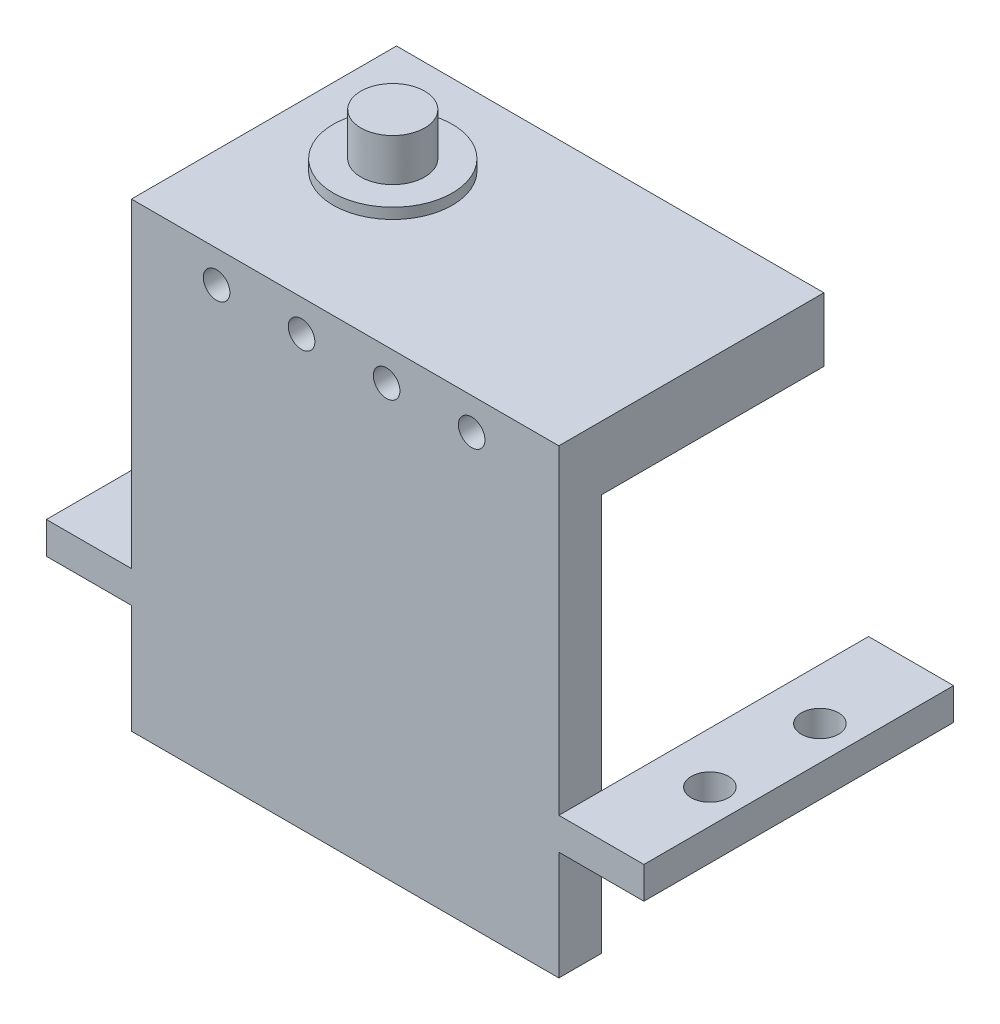
ISO-10303-21;
HEADER;
FILE_DESCRIPTION(('STEP AP214'),'2;1');
FILE_NAME('part.step','',(''),(''),'','','');
FILE_SCHEMA(('AUTOMOTIVE_DESIGN { 1 0 10303 214 1 1 1 1 }'));
ENDSEC;
DATA;
#1=APPLICATION_CONTEXT('core data for automotive mechanical design processes');
#2=APPLICATION_PROTOCOL_DEFINITION('international standard','automotive_design',2000,#1);
#3=PRODUCT_CONTEXT('',#1,'mechanical');
#4=PRODUCT('Part','Part','',(#3));
#5=PRODUCT_RELATED_PRODUCT_CATEGORY('part','',(#4));
#6=PRODUCT_DEFINITION_FORMATION('','',#4);
#7=PRODUCT_DEFINITION_CONTEXT('part definition',#1,'design');
#8=PRODUCT_DEFINITION('design','',#6,#7);
#9=PRODUCT_DEFINITION_SHAPE('','',#8);
#10=(LENGTH_UNIT() NAMED_UNIT(*) SI_UNIT(.MILLI.,.METRE.));
#11=(NAMED_UNIT(*) PLANE_ANGLE_UNIT() SI_UNIT($,.RADIAN.));
#12=(NAMED_UNIT(*) SI_UNIT($,.STERADIAN.) SOLID_ANGLE_UNIT());
#13=UNCERTAINTY_MEASURE_WITH_UNIT(LENGTH_MEASURE(1.E-05),#10,'distance_accuracy_value','');
#14=(GEOMETRIC_REPRESENTATION_CONTEXT(3) GLOBAL_UNCERTAINTY_ASSIGNED_CONTEXT((#13)) GLOBAL_UNIT_ASSIGNED_CONTEXT((#10,
#11,#12)) REPRESENTATION_CONTEXT('',''));
#15=CARTESIAN_POINT('',(0.,0.,0.));
#16=DIRECTION('',(0.,0.,1.));
#17=DIRECTION('',(1.,0.,0.));
#18=AXIS2_PLACEMENT_3D('',#15,#16,#17);
#19=CARTESIAN_POINT('',(-128.644230062294,-7.05911649459757,-10.5799999999999));
#20=DIRECTION('',(0.,-1.,0.));
#21=DIRECTION('',(0.,0.,-1.));
#22=AXIS2_PLACEMENT_3D('',#19,#20,#21);
#23=CYLINDRICAL_SURFACE('',#22,5.59999999999998);
#24=CARTESIAN_POINT('',(-128.644230062294,-7.05911649459757,-10.5799999999999));
#25=DIRECTION('',(0.,1.,0.));
#26=DIRECTION('',(0.,0.,1.));
#27=AXIS2_PLACEMENT_3D('',#24,#25,#26);
#28=CIRCLE('',#27,5.59999999999998);
#29=CARTESIAN_POINT('',(-128.644230062294,-7.05911649459757,-4.97999999999991));
#30=VERTEX_POINT('',#29);
#31=EDGE_CURVE('E51',#30,#30,#28,.T.);
#32=ORIENTED_EDGE('',*,*,#31,.F.);
#33=EDGE_LOOP('',(#32));
#34=FACE_BOUND('',#33,.T.);
#35=CARTESIAN_POINT('',(-128.644230062294,-8.05911649459757,-10.5799999999999));
#36=DIRECTION('',(0.,1.,0.));
#37=DIRECTION('',(0.,0.,1.));
#38=AXIS2_PLACEMENT_3D('',#35,#36,#37);
#39=CIRCLE('',#38,5.59999999999998);
#40=CARTESIAN_POINT('',(-128.644230062294,-8.05911649459757,-4.97999999999991));
#41=VERTEX_POINT('',#40);
#42=EDGE_CURVE('E56',#41,#41,#39,.T.);
#43=ORIENTED_EDGE('',*,*,#42,.T.);
#44=EDGE_LOOP('',(#43));
#45=FACE_BOUND('',#44,.T.);
#46=ADVANCED_FACE('F44',(#34,#45),#23,.T.);
#47=CARTESIAN_POINT('',(0.,-7.05911649459757,0.));
#48=DIRECTION('',(0.,1.,0.));
#49=DIRECTION('',(0.,0.,1.));
#50=AXIS2_PLACEMENT_3D('',#47,#48,#49);
#51=PLANE('',#50);
#52=CARTESIAN_POINT('',(-128.644230062294,-7.05911649459757,-10.5799999999999));
#53=DIRECTION('',(0.,1.,0.));
#54=DIRECTION('',(0.,0.,1.));
#55=AXIS2_PLACEMENT_3D('',#52,#53,#54);
#56=CIRCLE('',#55,2.99999999999999);
#57=CARTESIAN_POINT('',(-128.644230062294,-7.05911649459757,-7.5799999999999));
#58=VERTEX_POINT('',#57);
#59=EDGE_CURVE('E11',#58,#58,#56,.T.);
#60=ORIENTED_EDGE('',*,*,#59,.F.);
#61=EDGE_LOOP('',(#60));
#62=FACE_BOUND('',#61,.T.);
#63=ORIENTED_EDGE('',*,*,#31,.T.);
#64=EDGE_LOOP('',(#63));
#65=FACE_BOUND('',#64,.T.);
#66=ADVANCED_FACE('F89',(#62,#65),#51,.T.);
#67=CARTESIAN_POINT('',(0.,-8.05911649459757,0.));
#68=DIRECTION('',(0.,1.,0.));
#69=DIRECTION('',(0.,0.,1.));
#70=AXIS2_PLACEMENT_3D('',#67,#68,#69);
#71=PLANE('',#70);
#72=CARTESIAN_POINT('',(-128.644230062294,-8.05911649459757,-10.5799999999999));
#73=DIRECTION('',(0.,1.,0.));
#74=DIRECTION('',(0.,0.,1.));
#75=AXIS2_PLACEMENT_3D('',#72,#73,#74);
#76=CIRCLE('',#75,2.99999999999999);
#77=CARTESIAN_POINT('',(-128.644230062294,-8.05911649459757,-7.5799999999999));
#78=VERTEX_POINT('',#77);
#79=EDGE_CURVE('E47',#78,#78,#76,.T.);
#80=ORIENTED_EDGE('',*,*,#79,.T.);
#81=EDGE_LOOP('',(#80));
#82=FACE_BOUND('',#81,.T.);
#83=ORIENTED_EDGE('',*,*,#42,.F.);
#84=EDGE_LOOP('',(#83));
#85=FACE_BOUND('',#84,.T.);
#86=ADVANCED_FACE('F94',(#82,#85),#71,.F.);
#87=CARTESIAN_POINT('',(-128.644230062294,-9.05911649459755,-10.5799999999999));
#88=DIRECTION('',(0.,1.,0.));
#89=DIRECTION('',(-1.,0.,0.));
#90=AXIS2_PLACEMENT_3D('',#87,#88,#89);
#91=PLANE('',#90);
#92=CARTESIAN_POINT('',(-128.644230062294,-9.05911649459755,-10.5799999999999));
#93=DIRECTION('',(0.,1.,0.));
#94=DIRECTION('',(-1.,0.,0.));
#95=AXIS2_PLACEMENT_3D('',#92,#93,#94);
#96=CIRCLE('',#95,2.99999999999999);
#97=CARTESIAN_POINT('',(-131.644230062294,-9.05911649459755,-10.5799999999999));
#98=VERTEX_POINT('',#97);
#99=EDGE_CURVE('E59',#98,#98,#96,.T.);
#100=ORIENTED_EDGE('',*,*,#99,.F.);
#101=EDGE_LOOP('',(#100));
#102=FACE_BOUND('',#101,.T.);
#103=ADVANCED_FACE('F85',(#102),#91,.F.);
#104=CARTESIAN_POINT('',(-128.644230062294,-9.05911649459755,-10.5799999999999));
#105=DIRECTION('',(0.,1.,0.));
#106=DIRECTION('',(-1.,0.,0.));
#107=AXIS2_PLACEMENT_3D('',#104,#105,#106);
#108=CYLINDRICAL_SURFACE('',#107,2.99999999999999);
#109=ORIENTED_EDGE('',*,*,#99,.T.);
#110=EDGE_LOOP('',(#109));
#111=FACE_BOUND('',#110,.T.);
#112=ORIENTED_EDGE('',*,*,#79,.F.);
#113=EDGE_LOOP('',(#112));
#114=FACE_BOUND('',#113,.T.);
#115=ADVANCED_FACE('F78',(#111,#114),#108,.T.);
#116=ORIENTED_EDGE('',*,*,#59,.T.);
#117=EDGE_LOOP('',(#116));
#118=FACE_BOUND('',#117,.T.);
#119=CARTESIAN_POINT('',(-128.644230062294,-3.05911649459755,-10.5799999999999));
#120=DIRECTION('',(0.,1.,0.));
#121=DIRECTION('',(-1.,0.,0.));
#122=AXIS2_PLACEMENT_3D('',#119,#120,#121);
#123=CIRCLE('',#122,2.99999999999999);
#124=CARTESIAN_POINT('',(-131.644230062294,-3.05911649459755,-10.5799999999999));
#125=VERTEX_POINT('',#124);
#126=EDGE_CURVE('E68',#125,#125,#123,.T.);
#127=ORIENTED_EDGE('',*,*,#126,.F.);
#128=EDGE_LOOP('',(#127));
#129=FACE_BOUND('',#128,.T.);
#130=ADVANCED_FACE('F76',(#118,#129),#108,.T.);
#131=CARTESIAN_POINT('',(-128.644230062294,-3.05911649459755,-10.5799999999999));
#132=DIRECTION('',(0.,1.,0.));
#133=DIRECTION('',(-1.,0.,0.));
#134=AXIS2_PLACEMENT_3D('',#131,#132,#133);
#135=PLANE('',#134);
#136=ORIENTED_EDGE('',*,*,#126,.T.);
#137=EDGE_LOOP('',(#136));
#138=FACE_BOUND('',#137,.T.);
#139=ADVANCED_FACE('F74',(#138),#135,.T.);
#140=CLOSED_SHELL('',(#46,#66,#86,#103,#115,#130,#139));
#141=MANIFOLD_SOLID_BREP('B2',#140);
#142=CARTESIAN_POINT('',(0.,0.,-20.93));
#143=DIRECTION('',(0.,0.,1.));
#144=DIRECTION('',(1.,0.,0.));
#145=AXIS2_PLACEMENT_3D('',#142,#143,#144);
#146=PLANE('',#145);
#147=CARTESIAN_POINT('',(-106.644230049022,-11.0591164996487,-20.93));
#148=DIRECTION('',(0.,0.,1.));
#149=DIRECTION('',(1.,0.,0.));
#150=AXIS2_PLACEMENT_3D('',#147,#148,#149);
#151=CIRCLE('',#150,1.25);
#152=CARTESIAN_POINT('',(-105.394230049022,-11.0591164996487,-20.93));
#153=VERTEX_POINT('',#152);
#154=EDGE_CURVE('E813',#153,#153,#151,.F.);
#155=ORIENTED_EDGE('',*,*,#154,.F.);
#156=EDGE_LOOP('',(#155));
#157=FACE_BOUND('',#156,.T.);
#158=CARTESIAN_POINT('',(-122.644230049022,-11.0591164996487,-20.93));
#159=DIRECTION('',(0.,0.,1.));
#160=DIRECTION('',(1.,0.,0.));
#161=AXIS2_PLACEMENT_3D('',#158,#159,#160);
#162=CIRCLE('',#161,1.25);
#163=CARTESIAN_POINT('',(-121.394230049022,-11.0591164996487,-20.93));
#164=VERTEX_POINT('',#163);
#165=EDGE_CURVE('E811',#164,#164,#162,.F.);
#166=ORIENTED_EDGE('',*,*,#165,.F.);
#167=EDGE_LOOP('',(#166));
#168=FACE_BOUND('',#167,.T.);
#169=CARTESIAN_POINT('',(-114.644230049022,-11.0591164996487,-20.93));
#170=DIRECTION('',(0.,0.,1.));
#171=DIRECTION('',(1.,0.,0.));
#172=AXIS2_PLACEMENT_3D('',#169,#170,#171);
#173=CIRCLE('',#172,1.25);
#174=CARTESIAN_POINT('',(-113.394230049022,-11.0591164996487,-20.93));
#175=VERTEX_POINT('',#174);
#176=EDGE_CURVE('E418',#175,#175,#173,.F.);
#177=ORIENTED_EDGE('',*,*,#176,.F.);
#178=EDGE_LOOP('',(#177));
#179=FACE_BOUND('',#178,.T.);
#180=DIRECTION('',(0.,1.,0.));
#181=VECTOR('',#180,1.);
#182=CARTESIAN_POINT('',(-138.644230049022,-8.05911649459757,-20.93));
#183=LINE('',#182,#181);
#184=CARTESIAN_POINT('',(-138.644230049022,-14.0591164945976,-20.93));
#185=VERTEX_POINT('',#184);
#186=CARTESIAN_POINT('',(-138.644230049022,-8.05911649459757,-20.93));
#187=VERTEX_POINT('',#186);
#188=EDGE_CURVE('E396',#185,#187,#183,.T.);
#189=ORIENTED_EDGE('',*,*,#188,.T.);
#190=DIRECTION('',(1.,0.,0.));
#191=VECTOR('',#190,1.);
#192=CARTESIAN_POINT('',(-98.4442300490215,-8.05911649459757,-20.93));
#193=LINE('',#192,#191);
#194=CARTESIAN_POINT('',(-98.4442300490215,-8.05911649459757,-20.93));
#195=VERTEX_POINT('',#194);
#196=EDGE_CURVE('E404',#187,#195,#193,.T.);
#197=ORIENTED_EDGE('',*,*,#196,.T.);
#198=DIRECTION('',(0.,-1.,0.));
#199=VECTOR('',#198,1.);
#200=CARTESIAN_POINT('',(-98.4442300490215,-14.0591164945976,-20.93));
#201=LINE('',#200,#199);
#202=CARTESIAN_POINT('',(-98.4442300490215,-14.0591164945976,-20.93));
#203=VERTEX_POINT('',#202);
#204=EDGE_CURVE('E410',#195,#203,#201,.T.);
#205=ORIENTED_EDGE('',*,*,#204,.T.);
#206=DIRECTION('',(-1.,0.,0.));
#207=VECTOR('',#206,1.);
#208=CARTESIAN_POINT('',(-138.644230049022,-14.0591164945976,-20.93));
#209=LINE('',#208,#207);
#210=EDGE_CURVE('E414',#203,#185,#209,.T.);
#211=ORIENTED_EDGE('',*,*,#210,.T.);
#212=EDGE_LOOP('',(#189,#197,#205,#211));
#213=FACE_BOUND('',#212,.T.);
#214=CARTESIAN_POINT('',(-130.63625074283,-11.0591164945976,-20.93));
#215=DIRECTION('',(0.,0.,1.));
#216=DIRECTION('',(1.,0.,0.));
#217=AXIS2_PLACEMENT_3D('',#214,#215,#216);
#218=CIRCLE('',#217,1.25000000000001);
#219=CARTESIAN_POINT('',(-129.38625074283,-11.0591164945976,-20.93));
#220=VERTEX_POINT('',#219);
#221=EDGE_CURVE('E153',#220,#220,#218,.F.);
#222=ORIENTED_EDGE('',*,*,#221,.F.);
#223=EDGE_LOOP('',(#222));
#224=FACE_BOUND('',#223,.T.);
#225=ADVANCED_FACE('F149',(#157,#168,#179,#213,#224),#146,.F.);
#226=CARTESIAN_POINT('',(0.,0.,0.));
#227=DIRECTION('',(0.,0.,1.));
#228=DIRECTION('',(1.,0.,0.));
#229=AXIS2_PLACEMENT_3D('',#226,#227,#228);
#230=PLANE('',#229);
#231=DIRECTION('',(-1.,0.,0.));
#232=VECTOR('',#231,1.);
#233=CARTESIAN_POINT('',(-138.644230049022,-14.0591164945976,0.));
#234=LINE('',#233,#232);
#235=CARTESIAN_POINT('',(-98.4442300490215,-14.0591164945976,0.));
#236=VERTEX_POINT('',#235);
#237=CARTESIAN_POINT('',(-138.644230049022,-14.0591164945976,0.));
#238=VERTEX_POINT('',#237);
#239=EDGE_CURVE('E416',#236,#238,#234,.T.);
#240=ORIENTED_EDGE('',*,*,#239,.F.);
#241=DIRECTION('',(0.,1.,0.));
#242=VECTOR('',#241,1.);
#243=CARTESIAN_POINT('',(-98.4442300490215,0.,0.));
#244=LINE('',#243,#242);
#245=CARTESIAN_POINT('',(-98.4442300490215,-38.1591164945976,0.));
#246=VERTEX_POINT('',#245);
#247=EDGE_CURVE('E262',#246,#236,#244,.T.);
#248=ORIENTED_EDGE('',*,*,#247,.F.);
#249=DIRECTION('',(0.,1.,0.));
#250=VECTOR('',#249,1.);
#251=CARTESIAN_POINT('',(-98.4442300490215,-41.1591164945976,0.));
#252=LINE('',#251,#250);
#253=CARTESIAN_POINT('',(-98.4442300490216,-41.1591164945976,0.));
#254=VERTEX_POINT('',#253);
#255=EDGE_CURVE('E308',#254,#246,#252,.T.);
#256=ORIENTED_EDGE('',*,*,#255,.F.);
#257=DIRECTION('',(0.,-1.,0.));
#258=VECTOR('',#257,1.);
#259=CARTESIAN_POINT('',(-98.4442300490216,0.,0.));
#260=LINE('',#259,#258);
#261=CARTESIAN_POINT('',(-98.4442300490216,-51.4091164945976,0.));
#262=VERTEX_POINT('',#261);
#263=EDGE_CURVE('E258',#254,#262,#260,.T.);
#264=ORIENTED_EDGE('',*,*,#263,.T.);
#265=DIRECTION('',(-1.,0.,0.));
#266=VECTOR('',#265,1.);
#267=CARTESIAN_POINT('',(0.,-51.4091164945976,0.));
#268=LINE('',#267,#266);
#269=CARTESIAN_POINT('',(-138.644230049022,-51.4091164945976,0.));
#270=VERTEX_POINT('',#269);
#271=EDGE_CURVE('E256',#262,#270,#268,.T.);
#272=ORIENTED_EDGE('',*,*,#271,.T.);
#273=DIRECTION('',(0.,1.,0.));
#274=VECTOR('',#273,1.);
#275=CARTESIAN_POINT('',(-138.644230049022,0.,0.));
#276=LINE('',#275,#274);
#277=CARTESIAN_POINT('',(-138.644230049022,-41.1591164945976,0.));
#278=VERTEX_POINT('',#277);
#279=EDGE_CURVE('E268',#270,#278,#276,.T.);
#280=ORIENTED_EDGE('',*,*,#279,.T.);
#281=DIRECTION('',(0.,1.,0.));
#282=VECTOR('',#281,1.);
#283=CARTESIAN_POINT('',(-138.644230049022,0.,0.));
#284=LINE('',#283,#282);
#285=CARTESIAN_POINT('',(-138.644230049022,-38.1591164945976,0.));
#286=VERTEX_POINT('',#285);
#287=EDGE_CURVE('E312',#278,#286,#284,.T.);
#288=ORIENTED_EDGE('',*,*,#287,.T.);
#289=DIRECTION('',(0.,1.,0.));
#290=VECTOR('',#289,1.);
#291=CARTESIAN_POINT('',(-138.644230049022,0.,0.));
#292=LINE('',#291,#290);
#293=EDGE_CURVE('E265',#286,#238,#292,.T.);
#294=ORIENTED_EDGE('',*,*,#293,.T.);
#295=EDGE_LOOP('',(#240,#248,#256,#264,#272,#280,#288,#294));
#296=FACE_BOUND('',#295,.T.);
#297=ADVANCED_FACE('F471',(#296),#230,.F.);
#298=CARTESIAN_POINT('',(0.,-51.4091164945976,4.));
#299=DIRECTION('',(0.,-1.,0.));
#300=DIRECTION('',(0.,0.,-1.));
#301=AXIS2_PLACEMENT_3D('',#298,#299,#300);
#302=PLANE('',#301);
#303=ORIENTED_EDGE('',*,*,#271,.F.);
#304=DIRECTION('',(0.,0.,-1.));
#305=VECTOR('',#304,1.);
#306=CARTESIAN_POINT('',(-98.4442300490216,-51.4091164945976,4.));
#307=LINE('',#306,#305);
#308=CARTESIAN_POINT('',(-98.4442300490216,-51.4091164945976,4.));
#309=VERTEX_POINT('',#308);
#310=EDGE_CURVE('E42',#309,#262,#307,.T.);
#311=ORIENTED_EDGE('',*,*,#310,.F.);
#312=DIRECTION('',(-1.,0.,0.));
#313=VECTOR('',#312,1.);
#314=CARTESIAN_POINT('',(0.,-51.4091164945976,4.));
#315=LINE('',#314,#313);
#316=CARTESIAN_POINT('',(-138.644230049022,-51.4091164945976,4.));
#317=VERTEX_POINT('',#316);
#318=EDGE_CURVE('E271',#309,#317,#315,.T.);
#319=ORIENTED_EDGE('',*,*,#318,.T.);
#320=DIRECTION('',(0.,0.,-1.));
#321=VECTOR('',#320,1.);
#322=CARTESIAN_POINT('',(-138.644230049022,-51.4091164945976,4.));
#323=LINE('',#322,#321);
#324=EDGE_CURVE('E167',#317,#270,#323,.T.);
#325=ORIENTED_EDGE('',*,*,#324,.T.);
#326=EDGE_LOOP('',(#303,#311,#319,#325));
#327=FACE_BOUND('',#326,.T.);
#328=ADVANCED_FACE('F151',(#327),#302,.T.);
#329=CARTESIAN_POINT('',(-98.4442300490216,0.,4.));
#330=DIRECTION('',(1.,0.,0.));
#331=DIRECTION('',(0.,0.,-1.));
#332=AXIS2_PLACEMENT_3D('',#329,#330,#331);
#333=PLANE('',#332);
#334=ORIENTED_EDGE('',*,*,#263,.F.);
#335=DIRECTION('',(0.,0.,-1.));
#336=VECTOR('',#335,1.);
#337=CARTESIAN_POINT('',(-98.4442300490216,-41.1591164945976,4.));
#338=LINE('',#337,#336);
#339=CARTESIAN_POINT('',(-98.4442300490216,-41.1591164945976,4.));
#340=VERTEX_POINT('',#339);
#341=EDGE_CURVE('E159',#340,#254,#338,.T.);
#342=ORIENTED_EDGE('',*,*,#341,.F.);
#343=DIRECTION('',(0.,-1.,0.));
#344=VECTOR('',#343,1.);
#345=CARTESIAN_POINT('',(-98.4442300490216,0.,4.));
#346=LINE('',#345,#344);
#347=EDGE_CURVE('E331',#340,#309,#346,.T.);
#348=ORIENTED_EDGE('',*,*,#347,.T.);
#349=ORIENTED_EDGE('',*,*,#310,.T.);
#350=EDGE_LOOP('',(#334,#342,#348,#349));
#351=FACE_BOUND('',#350,.T.);
#352=ADVANCED_FACE('F302',(#351),#333,.T.);
#353=CARTESIAN_POINT('',(0.,-41.1591164945976,4.));
#354=DIRECTION('',(0.,-1.,0.));
#355=DIRECTION('',(0.,0.,-1.));
#356=AXIS2_PLACEMENT_3D('',#353,#354,#355);
#357=PLANE('',#356);
#358=CARTESIAN_POINT('',(-93.6442300622939,-41.1591164945976,-15.7549999999999));
#359=DIRECTION('',(0.,-1.,0.));
#360=DIRECTION('',(0.,0.,-1.));
#361=AXIS2_PLACEMENT_3D('',#358,#359,#360);
#362=CIRCLE('',#361,1.75);
#363=CARTESIAN_POINT('',(-93.6442300622939,-41.1591164945976,-17.5049999999999));
#364=VERTEX_POINT('',#363);
#365=EDGE_CURVE('E445',#364,#364,#362,.T.);
#366=ORIENTED_EDGE('',*,*,#365,.F.);
#367=EDGE_LOOP('',(#366));
#368=FACE_BOUND('',#367,.T.);
#369=CARTESIAN_POINT('',(-93.6442300622939,-41.1591164945976,-5.40499999999994));
#370=DIRECTION('',(0.,-1.,0.));
#371=DIRECTION('',(0.,0.,-1.));
#372=AXIS2_PLACEMENT_3D('',#369,#370,#371);
#373=CIRCLE('',#372,1.75);
#374=CARTESIAN_POINT('',(-93.6442300622939,-41.1591164945976,-7.15499999999994));
#375=VERTEX_POINT('',#374);
#376=EDGE_CURVE('E451',#375,#375,#373,.T.);
#377=ORIENTED_EDGE('',*,*,#376,.F.);
#378=EDGE_LOOP('',(#377));
#379=FACE_BOUND('',#378,.T.);
#380=ORIENTED_EDGE('',*,*,#341,.T.);
#381=DIRECTION('',(0.,0.,1.));
#382=VECTOR('',#381,1.);
#383=CARTESIAN_POINT('',(-98.4442300490215,-41.1591164945976,-25.13));
#384=LINE('',#383,#382);
#385=CARTESIAN_POINT('',(-98.4442300490215,-41.1591164945976,-25.13));
#386=VERTEX_POINT('',#385);
#387=EDGE_CURVE('E295',#386,#254,#384,.T.);
#388=ORIENTED_EDGE('',*,*,#387,.F.);
#389=DIRECTION('',(-1.,0.,0.));
#390=VECTOR('',#389,1.);
#391=CARTESIAN_POINT('',(-90.4442300490216,-41.1591164945976,-25.13));
#392=LINE('',#391,#390);
#393=CARTESIAN_POINT('',(-90.4442300490216,-41.1591164945976,-25.13));
#394=VERTEX_POINT('',#393);
#395=EDGE_CURVE('E457',#394,#386,#392,.T.);
#396=ORIENTED_EDGE('',*,*,#395,.F.);
#397=DIRECTION('',(0.,0.,-1.));
#398=VECTOR('',#397,1.);
#399=CARTESIAN_POINT('',(-90.4442300490216,-41.1591164945976,4.));
#400=LINE('',#399,#398);
#401=CARTESIAN_POINT('',(-90.4442300490216,-41.1591164945976,4.));
#402=VERTEX_POINT('',#401);
#403=EDGE_CURVE('E283',#402,#394,#400,.T.);
#404=ORIENTED_EDGE('',*,*,#403,.F.);
#405=DIRECTION('',(-1.,0.,0.));
#406=VECTOR('',#405,1.);
#407=CARTESIAN_POINT('',(0.,-41.1591164945976,4.));
#408=LINE('',#407,#406);
#409=EDGE_CURVE('E298',#402,#340,#408,.T.);
#410=ORIENTED_EDGE('',*,*,#409,.T.);
#411=EDGE_LOOP('',(#380,#388,#396,#404,#410));
#412=FACE_BOUND('',#411,.T.);
#413=ADVANCED_FACE('F291',(#368,#379,#412),#357,.T.);
#414=CARTESIAN_POINT('',(-90.4442300490216,0.,4.));
#415=DIRECTION('',(1.,0.,0.));
#416=DIRECTION('',(0.,0.,-1.));
#417=AXIS2_PLACEMENT_3D('',#414,#415,#416);
#418=PLANE('',#417);
#419=ORIENTED_EDGE('',*,*,#403,.T.);
#420=DIRECTION('',(0.,-1.,0.));
#421=VECTOR('',#420,1.);
#422=CARTESIAN_POINT('',(-90.4442300490216,-41.1591164945976,-25.13));
#423=LINE('',#422,#421);
#424=CARTESIAN_POINT('',(-90.4442300490216,-38.1591164945976,-25.13));
#425=VERTEX_POINT('',#424);
#426=EDGE_CURVE('E454',#425,#394,#423,.T.);
#427=ORIENTED_EDGE('',*,*,#426,.F.);
#428=DIRECTION('',(0.,0.,-1.));
#429=VECTOR('',#428,1.);
#430=CARTESIAN_POINT('',(-90.4442300490216,-38.1591164945976,4.));
#431=LINE('',#430,#429);
#432=CARTESIAN_POINT('',(-90.4442300490216,-38.1591164945976,4.));
#433=VERTEX_POINT('',#432);
#434=EDGE_CURVE('E280',#433,#425,#431,.T.);
#435=ORIENTED_EDGE('',*,*,#434,.F.);
#436=DIRECTION('',(0.,-1.,0.));
#437=VECTOR('',#436,1.);
#438=CARTESIAN_POINT('',(-90.4442300490216,0.,4.));
#439=LINE('',#438,#437);
#440=EDGE_CURVE('E334',#433,#402,#439,.T.);
#441=ORIENTED_EDGE('',*,*,#440,.T.);
#442=EDGE_LOOP('',(#419,#427,#435,#441));
#443=FACE_BOUND('',#442,.T.);
#444=ADVANCED_FACE('F467',(#443),#418,.T.);
#445=CARTESIAN_POINT('',(0.,-38.1591164945976,4.));
#446=DIRECTION('',(0.,1.,0.));
#447=DIRECTION('',(0.,0.,1.));
#448=AXIS2_PLACEMENT_3D('',#445,#446,#447);
#449=PLANE('',#448);
#450=CARTESIAN_POINT('',(-93.6442300622939,-38.1591164945977,-15.7549999999999));
#451=DIRECTION('',(0.,1.,0.));
#452=DIRECTION('',(-1.,0.,0.));
#453=AXIS2_PLACEMENT_3D('',#450,#451,#452);
#454=CIRCLE('',#453,1.75);
#455=CARTESIAN_POINT('',(-95.3942300622939,-38.1591164945977,-15.7549999999999));
#456=VERTEX_POINT('',#455);
#457=EDGE_CURVE('E442',#456,#456,#454,.T.);
#458=ORIENTED_EDGE('',*,*,#457,.F.);
#459=EDGE_LOOP('',(#458));
#460=FACE_BOUND('',#459,.T.);
#461=CARTESIAN_POINT('',(-93.6442300622939,-38.1591164945977,-5.40499999999994));
#462=DIRECTION('',(0.,1.,0.));
#463=DIRECTION('',(-1.,0.,0.));
#464=AXIS2_PLACEMENT_3D('',#461,#462,#463);
#465=CIRCLE('',#464,1.75);
#466=CARTESIAN_POINT('',(-95.3942300622939,-38.1591164945977,-5.40499999999994));
#467=VERTEX_POINT('',#466);
#468=EDGE_CURVE('E448',#467,#467,#465,.T.);
#469=ORIENTED_EDGE('',*,*,#468,.F.);
#470=EDGE_LOOP('',(#469));
#471=FACE_BOUND('',#470,.T.);
#472=ORIENTED_EDGE('',*,*,#434,.T.);
#473=DIRECTION('',(1.,0.,0.));
#474=VECTOR('',#473,1.);
#475=CARTESIAN_POINT('',(-90.4442300490216,-38.1591164945976,-25.13));
#476=LINE('',#475,#474);
#477=CARTESIAN_POINT('',(-98.4442300490215,-38.1591164945976,-25.13));
#478=VERTEX_POINT('',#477);
#479=EDGE_CURVE('E317',#478,#425,#476,.T.);
#480=ORIENTED_EDGE('',*,*,#479,.F.);
#481=DIRECTION('',(0.,0.,1.));
#482=VECTOR('',#481,1.);
#483=CARTESIAN_POINT('',(-98.4442300490215,-38.1591164945976,-25.13));
#484=LINE('',#483,#482);
#485=EDGE_CURVE('E313',#478,#246,#484,.T.);
#486=ORIENTED_EDGE('',*,*,#485,.T.);
#487=DIRECTION('',(0.,0.,-1.));
#488=VECTOR('',#487,1.);
#489=CARTESIAN_POINT('',(-98.4442300490215,-38.1591164945976,4.));
#490=LINE('',#489,#488);
#491=CARTESIAN_POINT('',(-98.4442300490215,-38.1591164945976,4.));
#492=VERTEX_POINT('',#491);
#493=EDGE_CURVE('E278',#492,#246,#490,.T.);
#494=ORIENTED_EDGE('',*,*,#493,.F.);
#495=DIRECTION('',(1.,0.,0.));
#496=VECTOR('',#495,1.);
#497=CARTESIAN_POINT('',(0.,-38.1591164945976,4.));
#498=LINE('',#497,#496);
#499=EDGE_CURVE('E337',#492,#433,#498,.T.);
#500=ORIENTED_EDGE('',*,*,#499,.T.);
#501=EDGE_LOOP('',(#472,#480,#486,#494,#500));
#502=FACE_BOUND('',#501,.T.);
#503=ADVANCED_FACE('F538',(#460,#471,#502),#449,.T.);
#504=CARTESIAN_POINT('',(-98.4442300490215,0.,4.));
#505=DIRECTION('',(-1.,0.,0.));
#506=DIRECTION('',(0.,0.,1.));
#507=AXIS2_PLACEMENT_3D('',#504,#505,#506);
#508=PLANE('',#507);
#509=ORIENTED_EDGE('',*,*,#247,.T.);
#510=DIRECTION('',(0.,0.,1.));
#511=VECTOR('',#510,1.);
#512=CARTESIAN_POINT('',(-98.4442300490215,-14.0591164945976,-20.93));
#513=LINE('',#512,#511);
#514=EDGE_CURVE('E401',#203,#236,#513,.T.);
#515=ORIENTED_EDGE('',*,*,#514,.F.);
#516=ORIENTED_EDGE('',*,*,#204,.F.);
#517=DIRECTION('',(0.,0.,-1.));
#518=VECTOR('',#517,1.);
#519=CARTESIAN_POINT('',(-98.4442300490215,-8.05911649459756,0.));
#520=LINE('',#519,#518);
#521=CARTESIAN_POINT('',(-98.4442300490215,-8.05911649459756,4.));
#522=VERTEX_POINT('',#521);
#523=EDGE_CURVE('E407',#522,#195,#520,.T.);
#524=ORIENTED_EDGE('',*,*,#523,.F.);
#525=DIRECTION('',(0.,1.,0.));
#526=VECTOR('',#525,1.);
#527=CARTESIAN_POINT('',(-98.4442300490215,0.,4.));
#528=LINE('',#527,#526);
#529=EDGE_CURVE('E340',#492,#522,#528,.T.);
#530=ORIENTED_EDGE('',*,*,#529,.F.);
#531=ORIENTED_EDGE('',*,*,#493,.T.);
#532=EDGE_LOOP('',(#509,#515,#516,#524,#530,#531));
#533=FACE_BOUND('',#532,.T.);
#534=ADVANCED_FACE('F535',(#533),#508,.F.);
#535=CARTESIAN_POINT('',(-138.644230049022,0.,4.));
#536=DIRECTION('',(-1.,0.,0.));
#537=DIRECTION('',(0.,0.,1.));
#538=AXIS2_PLACEMENT_3D('',#535,#536,#537);
#539=PLANE('',#538);
#540=ORIENTED_EDGE('',*,*,#293,.F.);
#541=DIRECTION('',(0.,0.,-1.));
#542=VECTOR('',#541,1.);
#543=CARTESIAN_POINT('',(-138.644230049022,-38.1591164945976,4.));
#544=LINE('',#543,#542);
#545=CARTESIAN_POINT('',(-138.644230049022,-38.1591164945976,4.));
#546=VERTEX_POINT('',#545);
#547=EDGE_CURVE('E275',#546,#286,#544,.T.);
#548=ORIENTED_EDGE('',*,*,#547,.F.);
#549=DIRECTION('',(0.,1.,0.));
#550=VECTOR('',#549,1.);
#551=CARTESIAN_POINT('',(-138.644230049022,0.,4.));
#552=LINE('',#551,#550);
#553=CARTESIAN_POINT('',(-138.644230049022,-8.05911649459756,4.));
#554=VERTEX_POINT('',#553);
#555=EDGE_CURVE('E343',#546,#554,#552,.T.);
#556=ORIENTED_EDGE('',*,*,#555,.T.);
#557=DIRECTION('',(0.,0.,1.));
#558=VECTOR('',#557,1.);
#559=CARTESIAN_POINT('',(-138.644230049022,-8.05911649459756,0.));
#560=LINE('',#559,#558);
#561=EDGE_CURVE('E391',#187,#554,#560,.T.);
#562=ORIENTED_EDGE('',*,*,#561,.F.);
#563=ORIENTED_EDGE('',*,*,#188,.F.);
#564=DIRECTION('',(0.,0.,1.));
#565=VECTOR('',#564,1.);
#566=CARTESIAN_POINT('',(-138.644230049022,-14.0591164945976,-20.93));
#567=LINE('',#566,#565);
#568=EDGE_CURVE('E424',#185,#238,#567,.T.);
#569=ORIENTED_EDGE('',*,*,#568,.T.);
#570=EDGE_LOOP('',(#540,#548,#556,#562,#563,#569));
#571=FACE_BOUND('',#570,.T.);
#572=ADVANCED_FACE('F393',(#571),#539,.T.);
#573=CARTESIAN_POINT('',(0.,-38.1591164945976,4.));
#574=DIRECTION('',(0.,1.,0.));
#575=DIRECTION('',(0.,0.,1.));
#576=AXIS2_PLACEMENT_3D('',#573,#574,#575);
#577=PLANE('',#576);
#578=CARTESIAN_POINT('',(-143.444230049021,-38.1591164945976,-5.40499999999994));
#579=DIRECTION('',(0.,1.,0.));
#580=DIRECTION('',(0.,0.,1.));
#581=AXIS2_PLACEMENT_3D('',#578,#579,#580);
#582=CIRCLE('',#581,1.75000000000001);
#583=CARTESIAN_POINT('',(-143.444230049021,-38.1591164945976,-3.65499999999993));
#584=VERTEX_POINT('',#583);
#585=EDGE_CURVE('E433',#584,#584,#582,.T.);
#586=ORIENTED_EDGE('',*,*,#585,.F.);
#587=EDGE_LOOP('',(#586));
#588=FACE_BOUND('',#587,.T.);
#589=CARTESIAN_POINT('',(-143.444230049022,-38.1591164945976,-15.7549999999999));
#590=DIRECTION('',(0.,1.,0.));
#591=DIRECTION('',(0.,0.,1.));
#592=AXIS2_PLACEMENT_3D('',#589,#590,#591);
#593=CIRCLE('',#592,1.75000000000001);
#594=CARTESIAN_POINT('',(-143.444230049022,-38.1591164945976,-14.0049999999999));
#595=VERTEX_POINT('',#594);
#596=EDGE_CURVE('E439',#595,#595,#593,.T.);
#597=ORIENTED_EDGE('',*,*,#596,.F.);
#598=EDGE_LOOP('',(#597));
#599=FACE_BOUND('',#598,.T.);
#600=ORIENTED_EDGE('',*,*,#547,.T.);
#601=DIRECTION('',(0.,0.,1.));
#602=VECTOR('',#601,1.);
#603=CARTESIAN_POINT('',(-138.644230049022,-38.1591164945976,-25.13));
#604=LINE('',#603,#602);
#605=CARTESIAN_POINT('',(-138.644230049022,-38.1591164945976,-25.13));
#606=VERTEX_POINT('',#605);
#607=EDGE_CURVE('E188',#606,#286,#604,.T.);
#608=ORIENTED_EDGE('',*,*,#607,.F.);
#609=DIRECTION('',(1.,0.,0.));
#610=VECTOR('',#609,1.);
#611=CARTESIAN_POINT('',(0.,-38.1591164945976,-25.13));
#612=LINE('',#611,#610);
#613=CARTESIAN_POINT('',(-146.644230049022,-38.1591164945976,-25.13));
#614=VERTEX_POINT('',#613);
#615=EDGE_CURVE('E325',#614,#606,#612,.T.);
#616=ORIENTED_EDGE('',*,*,#615,.F.);
#617=DIRECTION('',(0.,0.,-1.));
#618=VECTOR('',#617,1.);
#619=CARTESIAN_POINT('',(-146.644230049022,-38.1591164945976,4.));
#620=LINE('',#619,#618);
#621=CARTESIAN_POINT('',(-146.644230049022,-38.1591164945976,4.));
#622=VERTEX_POINT('',#621);
#623=EDGE_CURVE('E235',#622,#614,#620,.T.);
#624=ORIENTED_EDGE('',*,*,#623,.F.);
#625=DIRECTION('',(1.,0.,0.));
#626=VECTOR('',#625,1.);
#627=CARTESIAN_POINT('',(0.,-38.1591164945976,4.));
#628=LINE('',#627,#626);
#629=EDGE_CURVE('E246',#622,#546,#628,.T.);
#630=ORIENTED_EDGE('',*,*,#629,.T.);
#631=EDGE_LOOP('',(#600,#608,#616,#624,#630));
#632=FACE_BOUND('',#631,.T.);
#633=ADVANCED_FACE('F346',(#588,#599,#632),#577,.T.);
#634=CARTESIAN_POINT('',(-146.644230049022,0.,4.));
#635=DIRECTION('',(-1.,0.,0.));
#636=DIRECTION('',(0.,0.,1.));
#637=AXIS2_PLACEMENT_3D('',#634,#635,#636);
#638=PLANE('',#637);
#639=ORIENTED_EDGE('',*,*,#623,.T.);
#640=DIRECTION('',(0.,1.,0.));
#641=VECTOR('',#640,1.);
#642=CARTESIAN_POINT('',(-146.644230049022,0.,-25.13));
#643=LINE('',#642,#641);
#644=CARTESIAN_POINT('',(-146.644230049022,-41.1591164945976,-25.13));
#645=VERTEX_POINT('',#644);
#646=EDGE_CURVE('E230',#645,#614,#643,.T.);
#647=ORIENTED_EDGE('',*,*,#646,.F.);
#648=DIRECTION('',(0.,0.,-1.));
#649=VECTOR('',#648,1.);
#650=CARTESIAN_POINT('',(-146.644230049022,-41.1591164945976,4.));
#651=LINE('',#650,#649);
#652=CARTESIAN_POINT('',(-146.644230049022,-41.1591164945976,4.));
#653=VERTEX_POINT('',#652);
#654=EDGE_CURVE('E223',#653,#645,#651,.T.);
#655=ORIENTED_EDGE('',*,*,#654,.F.);
#656=DIRECTION('',(0.,1.,0.));
#657=VECTOR('',#656,1.);
#658=CARTESIAN_POINT('',(-146.644230049022,0.,4.));
#659=LINE('',#658,#657);
#660=EDGE_CURVE('E227',#653,#622,#659,.T.);
#661=ORIENTED_EDGE('',*,*,#660,.T.);
#662=EDGE_LOOP('',(#639,#647,#655,#661));
#663=FACE_BOUND('',#662,.T.);
#664=ADVANCED_FACE('F226',(#663),#638,.T.);
#665=CARTESIAN_POINT('',(0.,-41.1591164945976,4.));
#666=DIRECTION('',(0.,-1.,0.));
#667=DIRECTION('',(0.,0.,-1.));
#668=AXIS2_PLACEMENT_3D('',#665,#666,#667);
#669=PLANE('',#668);
#670=CARTESIAN_POINT('',(-143.444230049021,-41.1591164945976,-5.40499999999994));
#671=DIRECTION('',(0.,-1.,0.));
#672=DIRECTION('',(0.,0.,-1.));
#673=AXIS2_PLACEMENT_3D('',#670,#671,#672);
#674=CIRCLE('',#673,1.75000000000001);
#675=CARTESIAN_POINT('',(-143.444230049021,-41.1591164945976,-7.15499999999995));
#676=VERTEX_POINT('',#675);
#677=EDGE_CURVE('E430',#676,#676,#674,.T.);
#678=ORIENTED_EDGE('',*,*,#677,.F.);
#679=EDGE_LOOP('',(#678));
#680=FACE_BOUND('',#679,.T.);
#681=CARTESIAN_POINT('',(-143.444230049022,-41.1591164945976,-15.7549999999999));
#682=DIRECTION('',(0.,-1.,0.));
#683=DIRECTION('',(0.,0.,-1.));
#684=AXIS2_PLACEMENT_3D('',#681,#682,#683);
#685=CIRCLE('',#684,1.75000000000001);
#686=CARTESIAN_POINT('',(-143.444230049022,-41.1591164945976,-17.505));
#687=VERTEX_POINT('',#686);
#688=EDGE_CURVE('E436',#687,#687,#685,.T.);
#689=ORIENTED_EDGE('',*,*,#688,.F.);
#690=EDGE_LOOP('',(#689));
#691=FACE_BOUND('',#690,.T.);
#692=ORIENTED_EDGE('',*,*,#654,.T.);
#693=DIRECTION('',(-1.,0.,0.));
#694=VECTOR('',#693,1.);
#695=CARTESIAN_POINT('',(0.,-41.1591164945976,-25.13));
#696=LINE('',#695,#694);
#697=CARTESIAN_POINT('',(-138.644230049022,-41.1591164945976,-25.13));
#698=VERTEX_POINT('',#697);
#699=EDGE_CURVE('E322',#698,#645,#696,.T.);
#700=ORIENTED_EDGE('',*,*,#699,.F.);
#701=DIRECTION('',(0.,0.,1.));
#702=VECTOR('',#701,1.);
#703=CARTESIAN_POINT('',(-138.644230049022,-41.1591164945976,-25.13));
#704=LINE('',#703,#702);
#705=EDGE_CURVE('E259',#698,#278,#704,.T.);
#706=ORIENTED_EDGE('',*,*,#705,.T.);
#707=DIRECTION('',(0.,0.,-1.));
#708=VECTOR('',#707,1.);
#709=CARTESIAN_POINT('',(-138.644230049022,-41.1591164945976,4.));
#710=LINE('',#709,#708);
#711=CARTESIAN_POINT('',(-138.644230049022,-41.1591164945976,4.));
#712=VERTEX_POINT('',#711);
#713=EDGE_CURVE('E236',#712,#278,#710,.T.);
#714=ORIENTED_EDGE('',*,*,#713,.F.);
#715=DIRECTION('',(-1.,0.,0.));
#716=VECTOR('',#715,1.);
#717=CARTESIAN_POINT('',(0.,-41.1591164945976,4.));
#718=LINE('',#717,#716);
#719=EDGE_CURVE('E243',#712,#653,#718,.T.);
#720=ORIENTED_EDGE('',*,*,#719,.T.);
#721=EDGE_LOOP('',(#692,#700,#706,#714,#720));
#722=FACE_BOUND('',#721,.T.);
#723=ADVANCED_FACE('F248',(#680,#691,#722),#669,.T.);
#724=CARTESIAN_POINT('',(-138.644230049022,0.,4.));
#725=DIRECTION('',(-1.,0.,0.));
#726=DIRECTION('',(0.,0.,1.));
#727=AXIS2_PLACEMENT_3D('',#724,#725,#726);
#728=PLANE('',#727);
#729=ORIENTED_EDGE('',*,*,#279,.F.);
#730=ORIENTED_EDGE('',*,*,#324,.F.);
#731=DIRECTION('',(0.,1.,0.));
#732=VECTOR('',#731,1.);
#733=CARTESIAN_POINT('',(-138.644230049022,0.,4.));
#734=LINE('',#733,#732);
#735=EDGE_CURVE('E251',#317,#712,#734,.T.);
#736=ORIENTED_EDGE('',*,*,#735,.T.);
#737=ORIENTED_EDGE('',*,*,#713,.T.);
#738=EDGE_LOOP('',(#729,#730,#736,#737));
#739=FACE_BOUND('',#738,.T.);
#740=ADVANCED_FACE('F520',(#739),#728,.T.);
#741=CARTESIAN_POINT('',(0.,0.,4.));
#742=DIRECTION('',(0.,0.,1.));
#743=DIRECTION('',(1.,0.,0.));
#744=AXIS2_PLACEMENT_3D('',#741,#742,#743);
#745=PLANE('',#744);
#746=CARTESIAN_POINT('',(-106.644230049021,-11.0591164945976,4.));
#747=DIRECTION('',(0.,0.,1.));
#748=DIRECTION('',(1.,0.,0.));
#749=AXIS2_PLACEMENT_3D('',#746,#747,#748);
#750=CIRCLE('',#749,1.25);
#751=CARTESIAN_POINT('',(-105.394230049021,-11.0591164945976,4.));
#752=VERTEX_POINT('',#751);
#753=EDGE_CURVE('E799',#752,#752,#750,.F.);
#754=ORIENTED_EDGE('',*,*,#753,.T.);
#755=EDGE_LOOP('',(#754));
#756=FACE_BOUND('',#755,.T.);
#757=CARTESIAN_POINT('',(-130.63625074283,-11.0591164945976,4.));
#758=DIRECTION('',(0.,0.,1.));
#759=DIRECTION('',(1.,0.,0.));
#760=AXIS2_PLACEMENT_3D('',#757,#758,#759);
#761=CIRCLE('',#760,1.25000000000001);
#762=CARTESIAN_POINT('',(-129.38625074283,-11.0591164945976,4.));
#763=VERTEX_POINT('',#762);
#764=EDGE_CURVE('E796',#763,#763,#761,.F.);
#765=ORIENTED_EDGE('',*,*,#764,.T.);
#766=EDGE_LOOP('',(#765));
#767=FACE_BOUND('',#766,.T.);
#768=CARTESIAN_POINT('',(-114.644230049022,-11.0591164945976,4.));
#769=DIRECTION('',(0.,0.,1.));
#770=DIRECTION('',(1.,0.,0.));
#771=AXIS2_PLACEMENT_3D('',#768,#769,#770);
#772=CIRCLE('',#771,1.25);
#773=CARTESIAN_POINT('',(-113.394230049022,-11.0591164945976,4.));
#774=VERTEX_POINT('',#773);
#775=EDGE_CURVE('E803',#774,#774,#772,.F.);
#776=ORIENTED_EDGE('',*,*,#775,.T.);
#777=EDGE_LOOP('',(#776));
#778=FACE_BOUND('',#777,.T.);
#779=CARTESIAN_POINT('',(-122.644230049022,-11.0591164945976,4.));
#780=DIRECTION('',(0.,0.,1.));
#781=DIRECTION('',(1.,0.,0.));
#782=AXIS2_PLACEMENT_3D('',#779,#780,#781);
#783=CIRCLE('',#782,1.25);
#784=CARTESIAN_POINT('',(-121.394230049022,-11.0591164945976,4.));
#785=VERTEX_POINT('',#784);
#786=EDGE_CURVE('E800',#785,#785,#783,.F.);
#787=ORIENTED_EDGE('',*,*,#786,.T.);
#788=EDGE_LOOP('',(#787));
#789=FACE_BOUND('',#788,.T.);
#790=ORIENTED_EDGE('',*,*,#318,.F.);
#791=ORIENTED_EDGE('',*,*,#347,.F.);
#792=ORIENTED_EDGE('',*,*,#409,.F.);
#793=ORIENTED_EDGE('',*,*,#440,.F.);
#794=ORIENTED_EDGE('',*,*,#499,.F.);
#795=ORIENTED_EDGE('',*,*,#529,.T.);
#796=DIRECTION('',(1.,0.,0.));
#797=VECTOR('',#796,1.);
#798=CARTESIAN_POINT('',(-138.644230049022,-8.05911649459756,4.));
#799=LINE('',#798,#797);
#800=EDGE_CURVE('E400',#554,#522,#799,.T.);
#801=ORIENTED_EDGE('',*,*,#800,.F.);
#802=ORIENTED_EDGE('',*,*,#555,.F.);
#803=ORIENTED_EDGE('',*,*,#629,.F.);
#804=ORIENTED_EDGE('',*,*,#660,.F.);
#805=ORIENTED_EDGE('',*,*,#719,.F.);
#806=ORIENTED_EDGE('',*,*,#735,.F.);
#807=EDGE_LOOP('',(#790,#791,#792,#793,#794,#795,#801,#802,#803,#804,#805,#806));
#808=FACE_BOUND('',#807,.T.);
#809=ADVANCED_FACE('F241',(#756,#767,#778,#789,#808),#745,.T.);
#810=CARTESIAN_POINT('',(-138.644230049022,0.,-25.13));
#811=DIRECTION('',(1.,0.,0.));
#812=DIRECTION('',(0.,0.,-1.));
#813=AXIS2_PLACEMENT_3D('',#810,#811,#812);
#814=PLANE('',#813);
#815=ORIENTED_EDGE('',*,*,#287,.F.);
#816=ORIENTED_EDGE('',*,*,#705,.F.);
#817=DIRECTION('',(0.,1.,0.));
#818=VECTOR('',#817,1.);
#819=CARTESIAN_POINT('',(-138.644230049022,0.,-25.13));
#820=LINE('',#819,#818);
#821=EDGE_CURVE('E315',#698,#606,#820,.T.);
#822=ORIENTED_EDGE('',*,*,#821,.T.);
#823=ORIENTED_EDGE('',*,*,#607,.T.);
#824=EDGE_LOOP('',(#815,#816,#822,#823));
#825=FACE_BOUND('',#824,.T.);
#826=ADVANCED_FACE('F516',(#825),#814,.T.);
#827=CARTESIAN_POINT('',(0.,0.,-25.13));
#828=DIRECTION('',(0.,0.,-1.));
#829=DIRECTION('',(-1.,0.,0.));
#830=AXIS2_PLACEMENT_3D('',#827,#828,#829);
#831=PLANE('',#830);
#832=ORIENTED_EDGE('',*,*,#821,.F.);
#833=ORIENTED_EDGE('',*,*,#699,.T.);
#834=ORIENTED_EDGE('',*,*,#646,.T.);
#835=ORIENTED_EDGE('',*,*,#615,.T.);
#836=EDGE_LOOP('',(#832,#833,#834,#835));
#837=FACE_BOUND('',#836,.T.);
#838=ADVANCED_FACE('F353',(#837),#831,.T.);
#839=CARTESIAN_POINT('',(-98.4442300490215,-41.1591164945976,-25.13));
#840=DIRECTION('',(1.,0.,0.));
#841=DIRECTION('',(0.,0.,-1.));
#842=AXIS2_PLACEMENT_3D('',#839,#840,#841);
#843=PLANE('',#842);
#844=ORIENTED_EDGE('',*,*,#255,.T.);
#845=ORIENTED_EDGE('',*,*,#485,.F.);
#846=DIRECTION('',(0.,1.,0.));
#847=VECTOR('',#846,1.);
#848=CARTESIAN_POINT('',(-98.4442300490215,-41.1591164945976,-25.13));
#849=LINE('',#848,#847);
#850=EDGE_CURVE('E311',#386,#478,#849,.T.);
#851=ORIENTED_EDGE('',*,*,#850,.F.);
#852=ORIENTED_EDGE('',*,*,#387,.T.);
#853=EDGE_LOOP('',(#844,#845,#851,#852));
#854=FACE_BOUND('',#853,.T.);
#855=ADVANCED_FACE('F306',(#854),#843,.F.);
#856=CARTESIAN_POINT('',(0.,0.,-25.13));
#857=DIRECTION('',(0.,0.,1.));
#858=DIRECTION('',(1.,0.,0.));
#859=AXIS2_PLACEMENT_3D('',#856,#857,#858);
#860=PLANE('',#859);
#861=ORIENTED_EDGE('',*,*,#426,.T.);
#862=ORIENTED_EDGE('',*,*,#395,.T.);
#863=ORIENTED_EDGE('',*,*,#850,.T.);
#864=ORIENTED_EDGE('',*,*,#479,.T.);
#865=EDGE_LOOP('',(#861,#862,#863,#864));
#866=FACE_BOUND('',#865,.T.);
#867=ADVANCED_FACE('F464',(#866),#860,.F.);
#868=CARTESIAN_POINT('',(-93.6442300622939,-43.1591164945977,-5.40499999999994));
#869=DIRECTION('',(0.,1.,0.));
#870=DIRECTION('',(-1.,0.,0.));
#871=AXIS2_PLACEMENT_3D('',#868,#869,#870);
#872=CYLINDRICAL_SURFACE('',#871,1.75);
#873=ORIENTED_EDGE('',*,*,#376,.T.);
#874=EDGE_LOOP('',(#873));
#875=FACE_BOUND('',#874,.T.);
#876=ORIENTED_EDGE('',*,*,#468,.T.);
#877=EDGE_LOOP('',(#876));
#878=FACE_BOUND('',#877,.T.);
#879=ADVANCED_FACE('F505',(#875,#878),#872,.F.);
#880=CARTESIAN_POINT('',(-93.6442300622939,-43.1591164945977,-15.7549999999999));
#881=DIRECTION('',(0.,1.,0.));
#882=DIRECTION('',(-1.,0.,0.));
#883=AXIS2_PLACEMENT_3D('',#880,#881,#882);
#884=CYLINDRICAL_SURFACE('',#883,1.75);
#885=ORIENTED_EDGE('',*,*,#365,.T.);
#886=EDGE_LOOP('',(#885));
#887=FACE_BOUND('',#886,.T.);
#888=ORIENTED_EDGE('',*,*,#457,.T.);
#889=EDGE_LOOP('',(#888));
#890=FACE_BOUND('',#889,.T.);
#891=ADVANCED_FACE('F501',(#887,#890),#884,.F.);
#892=CARTESIAN_POINT('',(-143.444230049022,-35.1591164945976,-15.7549999999999));
#893=DIRECTION('',(0.,-1.,0.));
#894=DIRECTION('',(0.,0.,-1.));
#895=AXIS2_PLACEMENT_3D('',#892,#893,#894);
#896=CYLINDRICAL_SURFACE('',#895,1.75000000000001);
#897=ORIENTED_EDGE('',*,*,#596,.T.);
#898=EDGE_LOOP('',(#897));
#899=FACE_BOUND('',#898,.T.);
#900=ORIENTED_EDGE('',*,*,#688,.T.);
#901=EDGE_LOOP('',(#900));
#902=FACE_BOUND('',#901,.T.);
#903=ADVANCED_FACE('F497',(#899,#902),#896,.F.);
#904=CARTESIAN_POINT('',(-143.444230049021,-35.1591164945976,-5.40499999999994));
#905=DIRECTION('',(0.,-1.,0.));
#906=DIRECTION('',(0.,0.,-1.));
#907=AXIS2_PLACEMENT_3D('',#904,#905,#906);
#908=CYLINDRICAL_SURFACE('',#907,1.75000000000001);
#909=ORIENTED_EDGE('',*,*,#585,.T.);
#910=EDGE_LOOP('',(#909));
#911=FACE_BOUND('',#910,.T.);
#912=ORIENTED_EDGE('',*,*,#677,.T.);
#913=EDGE_LOOP('',(#912));
#914=FACE_BOUND('',#913,.T.);
#915=ADVANCED_FACE('F494',(#911,#914),#908,.F.);
#916=CARTESIAN_POINT('',(0.,-8.05911649459756,0.));
#917=DIRECTION('',(0.,1.,0.));
#918=DIRECTION('',(0.,0.,1.));
#919=AXIS2_PLACEMENT_3D('',#916,#917,#918);
#920=PLANE('',#919);
#921=ORIENTED_EDGE('',*,*,#561,.T.);
#922=ORIENTED_EDGE('',*,*,#800,.T.);
#923=ORIENTED_EDGE('',*,*,#523,.T.);
#924=ORIENTED_EDGE('',*,*,#196,.F.);
#925=EDGE_LOOP('',(#921,#922,#923,#924));
#926=FACE_BOUND('',#925,.T.);
#927=ADVANCED_FACE('F405',(#926),#920,.T.);
#928=CARTESIAN_POINT('',(-138.644230049022,-14.0591164945976,-20.93));
#929=DIRECTION('',(0.,1.,0.));
#930=DIRECTION('',(-1.,0.,0.));
#931=AXIS2_PLACEMENT_3D('',#928,#929,#930);
#932=PLANE('',#931);
#933=ORIENTED_EDGE('',*,*,#239,.T.);
#934=ORIENTED_EDGE('',*,*,#568,.F.);
#935=ORIENTED_EDGE('',*,*,#210,.F.);
#936=ORIENTED_EDGE('',*,*,#514,.T.);
#937=EDGE_LOOP('',(#933,#934,#935,#936));
#938=FACE_BOUND('',#937,.T.);
#939=ADVANCED_FACE('F488',(#938),#932,.F.);
#940=CARTESIAN_POINT('',(-114.644230049022,-11.0591164996487,-30.93));
#941=DIRECTION('',(0.,0.,1.));
#942=DIRECTION('',(1.,0.,0.));
#943=AXIS2_PLACEMENT_3D('',#940,#941,#942);
#944=CYLINDRICAL_SURFACE('',#943,1.25);
#945=ORIENTED_EDGE('',*,*,#176,.T.);
#946=EDGE_LOOP('',(#945));
#947=FACE_BOUND('',#946,.T.);
#948=ORIENTED_EDGE('',*,*,#775,.F.);
#949=EDGE_LOOP('',(#948));
#950=FACE_BOUND('',#949,.T.);
#951=ADVANCED_FACE('F486',(#947,#950),#944,.F.);
#952=CARTESIAN_POINT('',(-122.644230049022,-11.0591164996487,-30.93));
#953=DIRECTION('',(0.,0.,1.));
#954=DIRECTION('',(1.,0.,0.));
#955=AXIS2_PLACEMENT_3D('',#952,#953,#954);
#956=CYLINDRICAL_SURFACE('',#955,1.25);
#957=ORIENTED_EDGE('',*,*,#165,.T.);
#958=EDGE_LOOP('',(#957));
#959=FACE_BOUND('',#958,.T.);
#960=ORIENTED_EDGE('',*,*,#786,.F.);
#961=EDGE_LOOP('',(#960));
#962=FACE_BOUND('',#961,.T.);
#963=ADVANCED_FACE('F646',(#959,#962),#956,.F.);
#964=CARTESIAN_POINT('',(-106.644230049022,-11.0591164996487,-30.93));
#965=DIRECTION('',(0.,0.,1.));
#966=DIRECTION('',(1.,0.,0.));
#967=AXIS2_PLACEMENT_3D('',#964,#965,#966);
#968=CYLINDRICAL_SURFACE('',#967,1.25);
#969=ORIENTED_EDGE('',*,*,#154,.T.);
#970=EDGE_LOOP('',(#969));
#971=FACE_BOUND('',#970,.T.);
#972=ORIENTED_EDGE('',*,*,#753,.F.);
#973=EDGE_LOOP('',(#972));
#974=FACE_BOUND('',#973,.T.);
#975=ADVANCED_FACE('F653',(#971,#974),#968,.F.);
#976=CARTESIAN_POINT('',(-130.63625074283,-11.0591164945976,8.));
#977=DIRECTION('',(0.,0.,-1.));
#978=DIRECTION('',(-1.,0.,0.));
#979=AXIS2_PLACEMENT_3D('',#976,#977,#978);
#980=CYLINDRICAL_SURFACE('',#979,1.25000000000001);
#981=ORIENTED_EDGE('',*,*,#764,.F.);
#982=EDGE_LOOP('',(#981));
#983=FACE_BOUND('',#982,.T.);
#984=ORIENTED_EDGE('',*,*,#221,.T.);
#985=EDGE_LOOP('',(#984));
#986=FACE_BOUND('',#985,.T.);
#987=ADVANCED_FACE('F660',(#983,#986),#980,.F.);
#988=CLOSED_SHELL('',(#225,#297,#328,#352,#413,#444,#503,#534,#572,#633,#664,#723,#740,#809,
#826,#838,#855,#867,#879,#891,#903,#915,#927,#939,#951,#963,#975,#987));
#989=MANIFOLD_SOLID_BREP('B6',#988);
#990=ADVANCED_BREP_SHAPE_REPRESENTATION('',(#18,#141,#989),#14);
#991=SHAPE_DEFINITION_REPRESENTATION(#9,#990);
ENDSEC;
END-ISO-10303-21;
